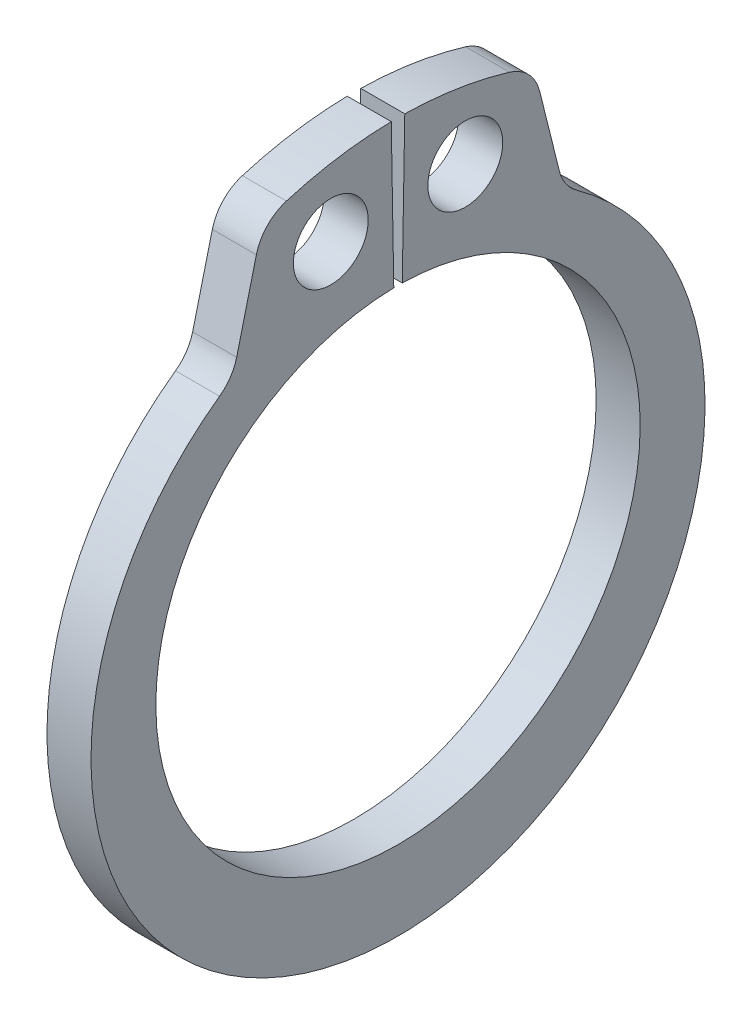
ISO-10303-21;
HEADER;
FILE_DESCRIPTION(('STEP AP214'),'2;1');
FILE_NAME('part.step','',(''),(''),'','','');
FILE_SCHEMA(('AUTOMOTIVE_DESIGN { 1 0 10303 214 1 1 1 1 }'));
ENDSEC;
DATA;
#1=APPLICATION_CONTEXT('core data for automotive mechanical design processes');
#2=APPLICATION_PROTOCOL_DEFINITION('international standard','automotive_design',2000,#1);
#3=PRODUCT_CONTEXT('',#1,'mechanical');
#4=PRODUCT('Part','Part','',(#3));
#5=PRODUCT_RELATED_PRODUCT_CATEGORY('part','',(#4));
#6=PRODUCT_DEFINITION_FORMATION('','',#4);
#7=PRODUCT_DEFINITION_CONTEXT('part definition',#1,'design');
#8=PRODUCT_DEFINITION('design','',#6,#7);
#9=PRODUCT_DEFINITION_SHAPE('','',#8);
#10=(LENGTH_UNIT() NAMED_UNIT(*) SI_UNIT(.MILLI.,.METRE.));
#11=(NAMED_UNIT(*) PLANE_ANGLE_UNIT() SI_UNIT($,.RADIAN.));
#12=(NAMED_UNIT(*) SI_UNIT($,.STERADIAN.) SOLID_ANGLE_UNIT());
#13=UNCERTAINTY_MEASURE_WITH_UNIT(LENGTH_MEASURE(1.E-05),#10,'distance_accuracy_value','');
#14=(GEOMETRIC_REPRESENTATION_CONTEXT(3) GLOBAL_UNCERTAINTY_ASSIGNED_CONTEXT((#13)) GLOBAL_UNIT_ASSIGNED_CONTEXT((#10,
#11,#12)) REPRESENTATION_CONTEXT('',''));
#15=CARTESIAN_POINT('',(0.,0.,0.));
#16=DIRECTION('',(0.,0.,1.));
#17=DIRECTION('',(1.,0.,0.));
#18=AXIS2_PLACEMENT_3D('',#15,#16,#17);
#19=CARTESIAN_POINT('',(0.5,0.,0.));
#20=DIRECTION('',(1.,0.,0.));
#21=DIRECTION('',(0.,0.,-1.));
#22=AXIS2_PLACEMENT_3D('',#19,#20,#21);
#23=PLANE('',#22);
#24=CARTESIAN_POINT('',(0.5,7.12443231524777,1.52716878314636));
#25=DIRECTION('',(1.,0.,0.));
#26=DIRECTION('',(0.,0.,-1.));
#27=AXIS2_PLACEMENT_3D('',#24,#25,#26);
#28=CIRCLE('',#27,0.85);
#29=CARTESIAN_POINT('',(0.5,7.12443231524777,0.677168783146362));
#30=VERTEX_POINT('',#29);
#31=EDGE_CURVE('E219',#30,#30,#28,.T.);
#32=ORIENTED_EDGE('',*,*,#31,.F.);
#33=EDGE_LOOP('',(#32));
#34=FACE_BOUND('',#33,.T.);
#35=CARTESIAN_POINT('',(0.5,0.,0.));
#36=DIRECTION('',(1.,0.,0.));
#37=DIRECTION('',(0.,0.,-1.));
#38=AXIS2_PLACEMENT_3D('',#35,#36,#37);
#39=CIRCLE('',#38,8.8);
#40=CARTESIAN_POINT('',(0.5,8.79865971737624,0.153581176648095));
#41=VERTEX_POINT('',#40);
#42=CARTESIAN_POINT('',(0.5,8.42695620843539,2.53503630370696));
#43=VERTEX_POINT('',#42);
#44=EDGE_CURVE('E136',#41,#43,#39,.T.);
#45=ORIENTED_EDGE('',*,*,#44,.T.);
#46=CARTESIAN_POINT('',(0.5,7.46934754838591,2.24696399646754));
#47=DIRECTION('',(1.,0.,0.));
#48=DIRECTION('',(0.,0.,-1.));
#49=AXIS2_PLACEMENT_3D('',#46,#47,#48);
#50=CIRCLE('',#49,1.);
#51=CARTESIAN_POINT('',(0.5,7.71126944398558,3.21725972274353));
#52=VERTEX_POINT('',#51);
#53=EDGE_CURVE('E173',#43,#52,#50,.T.);
#54=ORIENTED_EDGE('',*,*,#53,.T.);
#55=DIRECTION('',(0.,-0.970295726275997,0.241921895599665));
#56=VECTOR('',#55,1.);
#57=CARTESIAN_POINT('',(0.5,8.24150618523942,3.08505685501264));
#58=LINE('',#57,#56);
#59=CARTESIAN_POINT('',(0.5,5.91904505898335,3.66411144930298));
#60=VERTEX_POINT('',#59);
#61=EDGE_CURVE('E211',#52,#60,#58,.T.);
#62=ORIENTED_EDGE('',*,*,#61,.T.);
#63=CARTESIAN_POINT('',(0.5,6.16096695458302,4.63440717557898));
#64=DIRECTION('',(1.,0.,0.));
#65=DIRECTION('',(0.,0.,-1.));
#66=AXIS2_PLACEMENT_3D('',#63,#64,#65);
#67=CIRCLE('',#66,1.);
#68=CARTESIAN_POINT('',(0.5,5.34724606819442,4.05315136351775));
#69=VERTEX_POINT('',#68);
#70=EDGE_CURVE('E184',#60,#69,#67,.F.);
#71=ORIENTED_EDGE('',*,*,#70,.T.);
#72=CARTESIAN_POINT('',(0.5,-0.32690608951574,0.));
#73=DIRECTION('',(1.,0.,0.));
#74=DIRECTION('',(0.,0.,-1.));
#75=AXIS2_PLACEMENT_3D('',#72,#73,#74);
#76=CIRCLE('',#75,6.97309391048426);
#77=CARTESIAN_POINT('',(0.5,5.34724606819442,-4.05315136351775));
#78=VERTEX_POINT('',#77);
#79=EDGE_CURVE('E206',#69,#78,#76,.T.);
#80=ORIENTED_EDGE('',*,*,#79,.T.);
#81=CARTESIAN_POINT('',(0.5,6.16096695458301,-4.63440717557898));
#82=DIRECTION('',(1.,0.,0.));
#83=DIRECTION('',(0.,0.,-1.));
#84=AXIS2_PLACEMENT_3D('',#81,#82,#83);
#85=CIRCLE('',#84,1.);
#86=CARTESIAN_POINT('',(0.5,5.91904505898335,-3.66411144930298));
#87=VERTEX_POINT('',#86);
#88=EDGE_CURVE('E11',#78,#87,#85,.F.);
#89=ORIENTED_EDGE('',*,*,#88,.T.);
#90=DIRECTION('',(0.,0.970295726275997,0.241921895599667));
#91=VECTOR('',#90,1.);
#92=CARTESIAN_POINT('',(0.5,8.24150618523941,-3.08505685501264));
#93=LINE('',#92,#91);
#94=CARTESIAN_POINT('',(0.5,7.71126944398558,-3.21725972274353));
#95=VERTEX_POINT('',#94);
#96=EDGE_CURVE('E205',#87,#95,#93,.T.);
#97=ORIENTED_EDGE('',*,*,#96,.T.);
#98=CARTESIAN_POINT('',(0.5,7.46934754838591,-2.24696399646754));
#99=DIRECTION('',(1.,0.,0.));
#100=DIRECTION('',(0.,0.,-1.));
#101=AXIS2_PLACEMENT_3D('',#98,#99,#100);
#102=CIRCLE('',#101,1.);
#103=CARTESIAN_POINT('',(0.5,8.42695620843539,-2.53503630370696));
#104=VERTEX_POINT('',#103);
#105=EDGE_CURVE('E51',#95,#104,#102,.T.);
#106=ORIENTED_EDGE('',*,*,#105,.T.);
#107=CARTESIAN_POINT('',(0.5,0.,0.));
#108=DIRECTION('',(1.,0.,0.));
#109=DIRECTION('',(0.,0.,1.));
#110=AXIS2_PLACEMENT_3D('',#107,#108,#109);
#111=CIRCLE('',#110,8.8);
#112=CARTESIAN_POINT('',(0.5,8.79865971737624,-0.153581176648095));
#113=VERTEX_POINT('',#112);
#114=EDGE_CURVE('E208',#104,#113,#111,.T.);
#115=ORIENTED_EDGE('',*,*,#114,.T.);
#116=DIRECTION('',(0.,-0.999847695156391,0.0174524064372833));
#117=VECTOR('',#116,1.);
#118=CARTESIAN_POINT('',(0.5,8.79865971737624,-0.153581176648094));
#119=LINE('',#118,#117);
#120=CARTESIAN_POINT('',(0.5,5.49916232336015,-0.0959882354050595));
#121=VERTEX_POINT('',#120);
#122=EDGE_CURVE('E142',#113,#121,#119,.T.);
#123=ORIENTED_EDGE('',*,*,#122,.T.);
#124=CARTESIAN_POINT('',(0.5,0.,0.));
#125=DIRECTION('',(-1.,0.,0.));
#126=DIRECTION('',(0.,0.,-1.));
#127=AXIS2_PLACEMENT_3D('',#124,#125,#126);
#128=CIRCLE('',#127,5.5);
#129=CARTESIAN_POINT('',(0.5,5.49916232336015,0.0959882354050595));
#130=VERTEX_POINT('',#129);
#131=EDGE_CURVE('E137',#121,#130,#128,.T.);
#132=ORIENTED_EDGE('',*,*,#131,.T.);
#133=DIRECTION('',(0.,0.999847695156391,0.0174524064372836));
#134=VECTOR('',#133,1.);
#135=CARTESIAN_POINT('',(0.5,5.49916232336015,0.0959882354050595));
#136=LINE('',#135,#134);
#137=EDGE_CURVE('E126',#130,#41,#136,.T.);
#138=ORIENTED_EDGE('',*,*,#137,.T.);
#139=EDGE_LOOP('',(#45,#54,#62,#71,#80,#89,#97,#106,#115,#123,#132,#138));
#140=FACE_BOUND('',#139,.T.);
#141=CARTESIAN_POINT('',(0.5,7.12443231524777,-1.52716878314636));
#142=DIRECTION('',(1.,0.,0.));
#143=DIRECTION('',(0.,0.,-1.));
#144=AXIS2_PLACEMENT_3D('',#141,#142,#143);
#145=CIRCLE('',#144,0.85);
#146=CARTESIAN_POINT('',(0.5,7.12443231524777,-2.37716878314636));
#147=VERTEX_POINT('',#146);
#148=EDGE_CURVE('E248',#147,#147,#145,.T.);
#149=ORIENTED_EDGE('',*,*,#148,.F.);
#150=EDGE_LOOP('',(#149));
#151=FACE_BOUND('',#150,.T.);
#152=ADVANCED_FACE('F36',(#34,#140,#151),#23,.T.);
#153=CARTESIAN_POINT('',(-0.5,0.,0.));
#154=DIRECTION('',(1.,0.,0.));
#155=DIRECTION('',(0.,0.,-1.));
#156=AXIS2_PLACEMENT_3D('',#153,#154,#155);
#157=PLANE('',#156);
#158=CARTESIAN_POINT('',(-0.5,7.12443231524777,1.52716878314636));
#159=DIRECTION('',(1.,0.,0.));
#160=DIRECTION('',(0.,0.,-1.));
#161=AXIS2_PLACEMENT_3D('',#158,#159,#160);
#162=CIRCLE('',#161,0.85);
#163=CARTESIAN_POINT('',(-0.5,7.12443231524777,0.677168783146362));
#164=VERTEX_POINT('',#163);
#165=EDGE_CURVE('E245',#164,#164,#162,.T.);
#166=ORIENTED_EDGE('',*,*,#165,.T.);
#167=EDGE_LOOP('',(#166));
#168=FACE_BOUND('',#167,.T.);
#169=DIRECTION('',(0.,-0.970295726275997,0.241921895599665));
#170=VECTOR('',#169,1.);
#171=CARTESIAN_POINT('',(-0.5,8.24150618523942,3.08505685501264));
#172=LINE('',#171,#170);
#173=CARTESIAN_POINT('',(-0.5,7.71126944398558,3.21725972274353));
#174=VERTEX_POINT('',#173);
#175=CARTESIAN_POINT('',(-0.5,5.91904505898335,3.66411144930298));
#176=VERTEX_POINT('',#175);
#177=EDGE_CURVE('E202',#174,#176,#172,.T.);
#178=ORIENTED_EDGE('',*,*,#177,.F.);
#179=CARTESIAN_POINT('',(-0.5,7.46934754838591,2.24696399646754));
#180=DIRECTION('',(1.,0.,0.));
#181=DIRECTION('',(0.,0.,-1.));
#182=AXIS2_PLACEMENT_3D('',#179,#180,#181);
#183=CIRCLE('',#182,1.);
#184=CARTESIAN_POINT('',(-0.5,8.42695620843539,2.53503630370696));
#185=VERTEX_POINT('',#184);
#186=EDGE_CURVE('E168',#174,#185,#183,.F.);
#187=ORIENTED_EDGE('',*,*,#186,.T.);
#188=CARTESIAN_POINT('',(-0.5,0.,0.));
#189=DIRECTION('',(1.,0.,0.));
#190=DIRECTION('',(0.,0.,-1.));
#191=AXIS2_PLACEMENT_3D('',#188,#189,#190);
#192=CIRCLE('',#191,8.8);
#193=CARTESIAN_POINT('',(-0.5,8.79865971737624,0.153581176648095));
#194=VERTEX_POINT('',#193);
#195=EDGE_CURVE('E221',#194,#185,#192,.T.);
#196=ORIENTED_EDGE('',*,*,#195,.F.);
#197=DIRECTION('',(0.,0.999847695156391,0.0174524064372836));
#198=VECTOR('',#197,1.);
#199=CARTESIAN_POINT('',(-0.5,5.49916232336015,0.0959882354050595));
#200=LINE('',#199,#198);
#201=CARTESIAN_POINT('',(-0.5,5.49916232336015,0.0959882354050595));
#202=VERTEX_POINT('',#201);
#203=EDGE_CURVE('E218',#202,#194,#200,.T.);
#204=ORIENTED_EDGE('',*,*,#203,.F.);
#205=CARTESIAN_POINT('',(-0.5,0.,0.));
#206=DIRECTION('',(-1.,0.,0.));
#207=DIRECTION('',(0.,0.,-1.));
#208=AXIS2_PLACEMENT_3D('',#205,#206,#207);
#209=CIRCLE('',#208,5.5);
#210=CARTESIAN_POINT('',(-0.5,5.49916232336015,-0.0959882354050595));
#211=VERTEX_POINT('',#210);
#212=EDGE_CURVE('E150',#211,#202,#209,.T.);
#213=ORIENTED_EDGE('',*,*,#212,.F.);
#214=DIRECTION('',(0.,-0.999847695156391,0.0174524064372833));
#215=VECTOR('',#214,1.);
#216=CARTESIAN_POINT('',(-0.5,8.79865971737624,-0.153581176648094));
#217=LINE('',#216,#215);
#218=CARTESIAN_POINT('',(-0.5,8.79865971737624,-0.153581176648095));
#219=VERTEX_POINT('',#218);
#220=EDGE_CURVE('E146',#219,#211,#217,.T.);
#221=ORIENTED_EDGE('',*,*,#220,.F.);
#222=CARTESIAN_POINT('',(-0.5,0.,0.));
#223=DIRECTION('',(1.,0.,0.));
#224=DIRECTION('',(0.,0.,1.));
#225=AXIS2_PLACEMENT_3D('',#222,#223,#224);
#226=CIRCLE('',#225,8.8);
#227=CARTESIAN_POINT('',(-0.5,8.42695620843539,-2.53503630370696));
#228=VERTEX_POINT('',#227);
#229=EDGE_CURVE('E227',#228,#219,#226,.T.);
#230=ORIENTED_EDGE('',*,*,#229,.F.);
#231=CARTESIAN_POINT('',(-0.5,7.46934754838591,-2.24696399646754));
#232=DIRECTION('',(1.,0.,0.));
#233=DIRECTION('',(0.,0.,-1.));
#234=AXIS2_PLACEMENT_3D('',#231,#232,#233);
#235=CIRCLE('',#234,1.);
#236=CARTESIAN_POINT('',(-0.5,7.71126944398558,-3.21725972274353));
#237=VERTEX_POINT('',#236);
#238=EDGE_CURVE('E166',#228,#237,#235,.F.);
#239=ORIENTED_EDGE('',*,*,#238,.T.);
#240=DIRECTION('',(0.,0.970295726275997,0.241921895599667));
#241=VECTOR('',#240,1.);
#242=CARTESIAN_POINT('',(-0.5,8.24150618523941,-3.08505685501264));
#243=LINE('',#242,#241);
#244=CARTESIAN_POINT('',(-0.5,5.91904505898335,-3.66411144930298));
#245=VERTEX_POINT('',#244);
#246=EDGE_CURVE('E193',#245,#237,#243,.T.);
#247=ORIENTED_EDGE('',*,*,#246,.F.);
#248=CARTESIAN_POINT('',(-0.5,6.16096695458301,-4.63440717557898));
#249=DIRECTION('',(1.,0.,0.));
#250=DIRECTION('',(0.,0.,-1.));
#251=AXIS2_PLACEMENT_3D('',#248,#249,#250);
#252=CIRCLE('',#251,1.);
#253=CARTESIAN_POINT('',(-0.5,5.34724606819442,-4.05315136351775));
#254=VERTEX_POINT('',#253);
#255=EDGE_CURVE('E44',#245,#254,#252,.T.);
#256=ORIENTED_EDGE('',*,*,#255,.T.);
#257=CARTESIAN_POINT('',(-0.5,-0.32690608951574,0.));
#258=DIRECTION('',(1.,0.,0.));
#259=DIRECTION('',(0.,0.,-1.));
#260=AXIS2_PLACEMENT_3D('',#257,#258,#259);
#261=CIRCLE('',#260,6.97309391048426);
#262=CARTESIAN_POINT('',(-0.5,5.34724606819442,4.05315136351775));
#263=VERTEX_POINT('',#262);
#264=EDGE_CURVE('E192',#263,#254,#261,.T.);
#265=ORIENTED_EDGE('',*,*,#264,.F.);
#266=CARTESIAN_POINT('',(-0.5,6.16096695458302,4.63440717557898));
#267=DIRECTION('',(1.,0.,0.));
#268=DIRECTION('',(0.,0.,-1.));
#269=AXIS2_PLACEMENT_3D('',#266,#267,#268);
#270=CIRCLE('',#269,1.);
#271=EDGE_CURVE('E182',#263,#176,#270,.T.);
#272=ORIENTED_EDGE('',*,*,#271,.T.);
#273=EDGE_LOOP('',(#178,#187,#196,#204,#213,#221,#230,#239,#247,#256,#265,#272));
#274=FACE_BOUND('',#273,.T.);
#275=CARTESIAN_POINT('',(-0.5,7.12443231524777,-1.52716878314636));
#276=DIRECTION('',(1.,0.,0.));
#277=DIRECTION('',(0.,0.,-1.));
#278=AXIS2_PLACEMENT_3D('',#275,#276,#277);
#279=CIRCLE('',#278,0.85);
#280=CARTESIAN_POINT('',(-0.5,7.12443231524777,-2.37716878314636));
#281=VERTEX_POINT('',#280);
#282=EDGE_CURVE('E251',#281,#281,#279,.T.);
#283=ORIENTED_EDGE('',*,*,#282,.T.);
#284=EDGE_LOOP('',(#283));
#285=FACE_BOUND('',#284,.T.);
#286=ADVANCED_FACE('F190',(#168,#274,#285),#157,.F.);
#287=CARTESIAN_POINT('',(0.5,0.,0.));
#288=DIRECTION('',(-1.,0.,0.));
#289=DIRECTION('',(0.,0.,1.));
#290=AXIS2_PLACEMENT_3D('',#287,#288,#289);
#291=CYLINDRICAL_SURFACE('',#290,5.5);
#292=ORIENTED_EDGE('',*,*,#212,.T.);
#293=DIRECTION('',(-1.,0.,0.));
#294=VECTOR('',#293,1.);
#295=CARTESIAN_POINT('',(0.5,5.49916232336015,0.0959882354050595));
#296=LINE('',#295,#294);
#297=EDGE_CURVE('E130',#130,#202,#296,.T.);
#298=ORIENTED_EDGE('',*,*,#297,.F.);
#299=ORIENTED_EDGE('',*,*,#131,.F.);
#300=DIRECTION('',(-1.,0.,0.));
#301=VECTOR('',#300,1.);
#302=CARTESIAN_POINT('',(0.5,5.49916232336015,-0.0959882354050595));
#303=LINE('',#302,#301);
#304=EDGE_CURVE('E216',#121,#211,#303,.T.);
#305=ORIENTED_EDGE('',*,*,#304,.T.);
#306=EDGE_LOOP('',(#292,#298,#299,#305));
#307=FACE_BOUND('',#306,.T.);
#308=ADVANCED_FACE('F148',(#307),#291,.F.);
#309=CARTESIAN_POINT('',(0.5,5.49916232336015,0.0959882354050595));
#310=DIRECTION('',(0.,-0.0174524064372836,0.999847695156391));
#311=DIRECTION('',(0.,-0.999847695156391,-0.0174524064372836));
#312=AXIS2_PLACEMENT_3D('',#309,#310,#311);
#313=PLANE('',#312);
#314=ORIENTED_EDGE('',*,*,#203,.T.);
#315=DIRECTION('',(-1.,0.,0.));
#316=VECTOR('',#315,1.);
#317=CARTESIAN_POINT('',(0.5,8.79865971737624,0.153581176648095));
#318=LINE('',#317,#316);
#319=EDGE_CURVE('E133',#41,#194,#318,.T.);
#320=ORIENTED_EDGE('',*,*,#319,.F.);
#321=ORIENTED_EDGE('',*,*,#137,.F.);
#322=ORIENTED_EDGE('',*,*,#297,.T.);
#323=EDGE_LOOP('',(#314,#320,#321,#322));
#324=FACE_BOUND('',#323,.T.);
#325=ADVANCED_FACE('F128',(#324),#313,.F.);
#326=CARTESIAN_POINT('',(0.5,0.,0.));
#327=DIRECTION('',(-1.,0.,0.));
#328=DIRECTION('',(0.,0.,1.));
#329=AXIS2_PLACEMENT_3D('',#326,#327,#328);
#330=CYLINDRICAL_SURFACE('',#329,8.8);
#331=ORIENTED_EDGE('',*,*,#195,.T.);
#332=DIRECTION('',(-1.,0.,0.));
#333=VECTOR('',#332,1.);
#334=CARTESIAN_POINT('',(0.5,8.42695620843539,2.53503630370696));
#335=LINE('',#334,#333);
#336=EDGE_CURVE('E170',#185,#43,#335,.F.);
#337=ORIENTED_EDGE('',*,*,#336,.T.);
#338=ORIENTED_EDGE('',*,*,#44,.F.);
#339=ORIENTED_EDGE('',*,*,#319,.T.);
#340=EDGE_LOOP('',(#331,#337,#338,#339));
#341=FACE_BOUND('',#340,.T.);
#342=ADVANCED_FACE('F239',(#341),#330,.T.);
#343=CARTESIAN_POINT('',(0.5,8.24150618523942,3.08505685501264));
#344=DIRECTION('',(0.,-0.241921895599665,-0.970295726275997));
#345=DIRECTION('',(0.,0.970295726275997,-0.241921895599665));
#346=AXIS2_PLACEMENT_3D('',#343,#344,#345);
#347=PLANE('',#346);
#348=ORIENTED_EDGE('',*,*,#177,.T.);
#349=DIRECTION('',(1.,0.,0.));
#350=VECTOR('',#349,1.);
#351=CARTESIAN_POINT('',(0.5,5.91904505898335,3.66411144930298));
#352=LINE('',#351,#350);
#353=EDGE_CURVE('E164',#176,#60,#352,.T.);
#354=ORIENTED_EDGE('',*,*,#353,.T.);
#355=ORIENTED_EDGE('',*,*,#61,.F.);
#356=DIRECTION('',(-1.,0.,0.));
#357=VECTOR('',#356,1.);
#358=CARTESIAN_POINT('',(0.5,7.71126944398558,3.21725972274353));
#359=LINE('',#358,#357);
#360=EDGE_CURVE('E161',#52,#174,#359,.T.);
#361=ORIENTED_EDGE('',*,*,#360,.T.);
#362=EDGE_LOOP('',(#348,#354,#355,#361));
#363=FACE_BOUND('',#362,.T.);
#364=ADVANCED_FACE('F281',(#363),#347,.F.);
#365=CARTESIAN_POINT('',(0.5,-0.32690608951574,0.));
#366=DIRECTION('',(-1.,0.,0.));
#367=DIRECTION('',(0.,0.,1.));
#368=AXIS2_PLACEMENT_3D('',#365,#366,#367);
#369=CYLINDRICAL_SURFACE('',#368,6.97309391048426);
#370=ORIENTED_EDGE('',*,*,#79,.F.);
#371=DIRECTION('',(-1.,0.,0.));
#372=VECTOR('',#371,1.);
#373=CARTESIAN_POINT('',(0.5,5.34724606819442,4.05315136351775));
#374=LINE('',#373,#372);
#375=EDGE_CURVE('E153',#69,#263,#374,.T.);
#376=ORIENTED_EDGE('',*,*,#375,.T.);
#377=ORIENTED_EDGE('',*,*,#264,.T.);
#378=DIRECTION('',(-1.,0.,0.));
#379=VECTOR('',#378,1.);
#380=CARTESIAN_POINT('',(0.5,5.34724606819442,-4.05315136351775));
#381=LINE('',#380,#379);
#382=EDGE_CURVE('E151',#254,#78,#381,.F.);
#383=ORIENTED_EDGE('',*,*,#382,.T.);
#384=EDGE_LOOP('',(#370,#376,#377,#383));
#385=FACE_BOUND('',#384,.T.);
#386=ADVANCED_FACE('F199',(#385),#369,.T.);
#387=CARTESIAN_POINT('',(0.5,8.24150618523941,-3.08505685501264));
#388=DIRECTION('',(0.,-0.241921895599667,0.970295726275997));
#389=DIRECTION('',(0.,-0.970295726275997,-0.241921895599667));
#390=AXIS2_PLACEMENT_3D('',#387,#388,#389);
#391=PLANE('',#390);
#392=ORIENTED_EDGE('',*,*,#246,.T.);
#393=DIRECTION('',(-1.,0.,0.));
#394=VECTOR('',#393,1.);
#395=CARTESIAN_POINT('',(0.5,7.71126944398558,-3.21725972274353));
#396=LINE('',#395,#394);
#397=EDGE_CURVE('E59',#237,#95,#396,.F.);
#398=ORIENTED_EDGE('',*,*,#397,.T.);
#399=ORIENTED_EDGE('',*,*,#96,.F.);
#400=DIRECTION('',(1.,0.,0.));
#401=VECTOR('',#400,1.);
#402=CARTESIAN_POINT('',(-0.5,5.91904505898335,-3.66411144930298));
#403=LINE('',#402,#401);
#404=EDGE_CURVE('E178',#87,#245,#403,.F.);
#405=ORIENTED_EDGE('',*,*,#404,.T.);
#406=EDGE_LOOP('',(#392,#398,#399,#405));
#407=FACE_BOUND('',#406,.T.);
#408=ADVANCED_FACE('F207',(#407),#391,.F.);
#409=CARTESIAN_POINT('',(0.5,0.,0.));
#410=DIRECTION('',(-1.,0.,0.));
#411=DIRECTION('',(0.,0.,1.));
#412=AXIS2_PLACEMENT_3D('',#409,#410,#411);
#413=CYLINDRICAL_SURFACE('',#412,8.8);
#414=ORIENTED_EDGE('',*,*,#114,.F.);
#415=DIRECTION('',(-1.,0.,0.));
#416=VECTOR('',#415,1.);
#417=CARTESIAN_POINT('',(0.5,8.42695620843539,-2.53503630370696));
#418=LINE('',#417,#416);
#419=EDGE_CURVE('E175',#104,#228,#418,.T.);
#420=ORIENTED_EDGE('',*,*,#419,.T.);
#421=ORIENTED_EDGE('',*,*,#229,.T.);
#422=DIRECTION('',(-1.,0.,0.));
#423=VECTOR('',#422,1.);
#424=CARTESIAN_POINT('',(0.5,8.79865971737624,-0.153581176648095));
#425=LINE('',#424,#423);
#426=EDGE_CURVE('E155',#113,#219,#425,.T.);
#427=ORIENTED_EDGE('',*,*,#426,.F.);
#428=EDGE_LOOP('',(#414,#420,#421,#427));
#429=FACE_BOUND('',#428,.T.);
#430=ADVANCED_FACE('F274',(#429),#413,.T.);
#431=CARTESIAN_POINT('',(0.5,8.79865971737624,-0.153581176648094));
#432=DIRECTION('',(0.,-0.0174524064372833,-0.999847695156391));
#433=DIRECTION('',(0.,0.999847695156391,-0.0174524064372833));
#434=AXIS2_PLACEMENT_3D('',#431,#432,#433);
#435=PLANE('',#434);
#436=ORIENTED_EDGE('',*,*,#220,.T.);
#437=ORIENTED_EDGE('',*,*,#304,.F.);
#438=ORIENTED_EDGE('',*,*,#122,.F.);
#439=ORIENTED_EDGE('',*,*,#426,.T.);
#440=EDGE_LOOP('',(#436,#437,#438,#439));
#441=FACE_BOUND('',#440,.T.);
#442=ADVANCED_FACE('F234',(#441),#435,.F.);
#443=CARTESIAN_POINT('',(0.5,7.12443231524777,1.52716878314636));
#444=DIRECTION('',(-1.,0.,0.));
#445=DIRECTION('',(0.,0.,1.));
#446=AXIS2_PLACEMENT_3D('',#443,#444,#445);
#447=CYLINDRICAL_SURFACE('',#446,0.85);
#448=ORIENTED_EDGE('',*,*,#31,.T.);
#449=EDGE_LOOP('',(#448));
#450=FACE_BOUND('',#449,.T.);
#451=ORIENTED_EDGE('',*,*,#165,.F.);
#452=EDGE_LOOP('',(#451));
#453=FACE_BOUND('',#452,.T.);
#454=ADVANCED_FACE('F269',(#450,#453),#447,.F.);
#455=CARTESIAN_POINT('',(0.5,7.12443231524777,-1.52716878314636));
#456=DIRECTION('',(-1.,0.,0.));
#457=DIRECTION('',(0.,0.,1.));
#458=AXIS2_PLACEMENT_3D('',#455,#456,#457);
#459=CYLINDRICAL_SURFACE('',#458,0.85);
#460=ORIENTED_EDGE('',*,*,#148,.T.);
#461=EDGE_LOOP('',(#460));
#462=FACE_BOUND('',#461,.T.);
#463=ORIENTED_EDGE('',*,*,#282,.F.);
#464=EDGE_LOOP('',(#463));
#465=FACE_BOUND('',#464,.T.);
#466=ADVANCED_FACE('F257',(#462,#465),#459,.F.);
#467=CARTESIAN_POINT('',(0.5,6.16096695458302,4.63440717557898));
#468=DIRECTION('',(-1.,0.,0.));
#469=DIRECTION('',(0.,0.,1.));
#470=AXIS2_PLACEMENT_3D('',#467,#468,#469);
#471=CYLINDRICAL_SURFACE('',#470,1.);
#472=ORIENTED_EDGE('',*,*,#70,.F.);
#473=ORIENTED_EDGE('',*,*,#353,.F.);
#474=ORIENTED_EDGE('',*,*,#271,.F.);
#475=ORIENTED_EDGE('',*,*,#375,.F.);
#476=EDGE_LOOP('',(#472,#473,#474,#475));
#477=FACE_BOUND('',#476,.T.);
#478=ADVANCED_FACE('F291',(#477),#471,.F.);
#479=CARTESIAN_POINT('',(0.5,7.46934754838591,2.24696399646754));
#480=DIRECTION('',(-1.,0.,0.));
#481=DIRECTION('',(0.,0.,1.));
#482=AXIS2_PLACEMENT_3D('',#479,#480,#481);
#483=CYLINDRICAL_SURFACE('',#482,1.);
#484=ORIENTED_EDGE('',*,*,#53,.F.);
#485=ORIENTED_EDGE('',*,*,#336,.F.);
#486=ORIENTED_EDGE('',*,*,#186,.F.);
#487=ORIENTED_EDGE('',*,*,#360,.F.);
#488=EDGE_LOOP('',(#484,#485,#486,#487));
#489=FACE_BOUND('',#488,.T.);
#490=ADVANCED_FACE('F294',(#489),#483,.T.);
#491=CARTESIAN_POINT('',(0.5,7.46934754838591,-2.24696399646754));
#492=DIRECTION('',(-1.,0.,0.));
#493=DIRECTION('',(0.,0.,1.));
#494=AXIS2_PLACEMENT_3D('',#491,#492,#493);
#495=CYLINDRICAL_SURFACE('',#494,1.);
#496=ORIENTED_EDGE('',*,*,#105,.F.);
#497=ORIENTED_EDGE('',*,*,#397,.F.);
#498=ORIENTED_EDGE('',*,*,#238,.F.);
#499=ORIENTED_EDGE('',*,*,#419,.F.);
#500=EDGE_LOOP('',(#496,#497,#498,#499));
#501=FACE_BOUND('',#500,.T.);
#502=ADVANCED_FACE('F297',(#501),#495,.T.);
#503=CARTESIAN_POINT('',(0.5,6.16096695458301,-4.63440717557898));
#504=DIRECTION('',(-1.,0.,0.));
#505=DIRECTION('',(0.,0.,1.));
#506=AXIS2_PLACEMENT_3D('',#503,#504,#505);
#507=CYLINDRICAL_SURFACE('',#506,1.);
#508=ORIENTED_EDGE('',*,*,#88,.F.);
#509=ORIENTED_EDGE('',*,*,#382,.F.);
#510=ORIENTED_EDGE('',*,*,#255,.F.);
#511=ORIENTED_EDGE('',*,*,#404,.F.);
#512=EDGE_LOOP('',(#508,#509,#510,#511));
#513=FACE_BOUND('',#512,.T.);
#514=ADVANCED_FACE('F38',(#513),#507,.F.);
#515=CLOSED_SHELL('',(#152,#286,#308,#325,#342,#364,#386,#408,#430,#442,#454,#466,#478,#490,
#502,#514));
#516=MANIFOLD_SOLID_BREP('B2',#515);
#517=ADVANCED_BREP_SHAPE_REPRESENTATION('',(#18,#516),#14);
#518=SHAPE_DEFINITION_REPRESENTATION(#9,#517);
ENDSEC;
END-ISO-10303-21;
